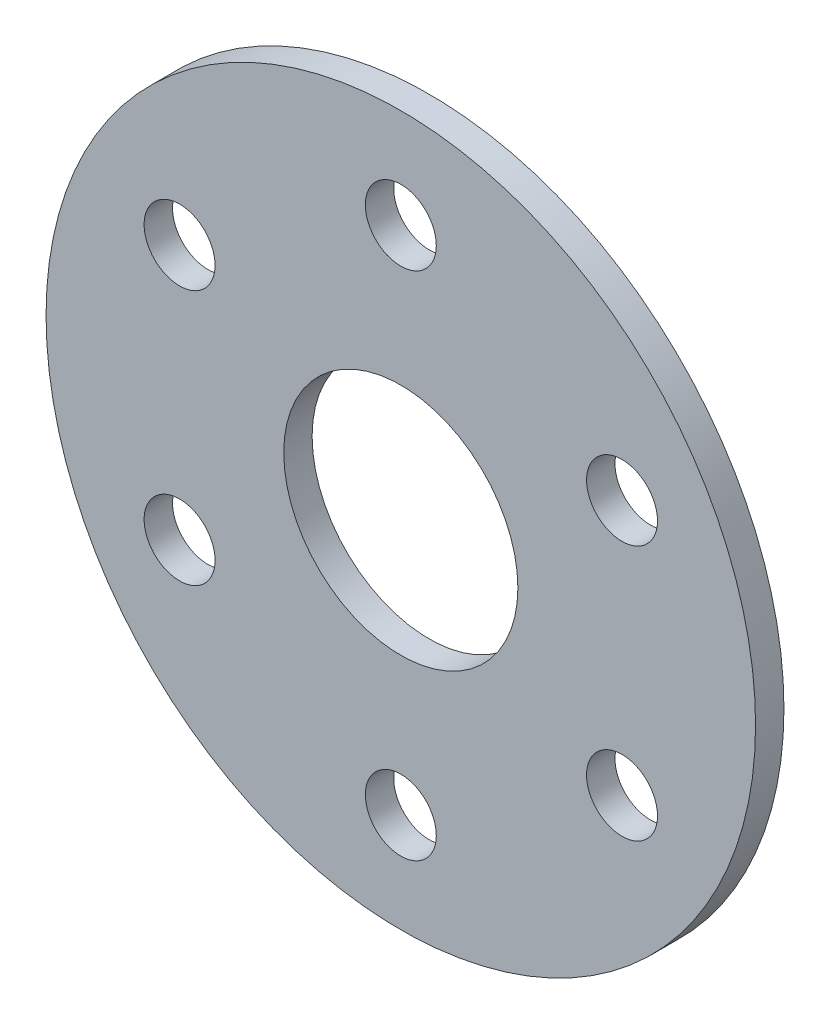
ISO-10303-21;
HEADER;
FILE_DESCRIPTION(('STEP AP214'),'2;1');
FILE_NAME('part.step','',(''),(''),'','','');
FILE_SCHEMA(('AUTOMOTIVE_DESIGN { 1 0 10303 214 1 1 1 1 }'));
ENDSEC;
DATA;
#1=APPLICATION_CONTEXT('core data for automotive mechanical design processes');
#2=APPLICATION_PROTOCOL_DEFINITION('international standard','automotive_design',2000,#1);
#3=PRODUCT_CONTEXT('',#1,'mechanical');
#4=PRODUCT('Part','Part','',(#3));
#5=PRODUCT_RELATED_PRODUCT_CATEGORY('part','',(#4));
#6=PRODUCT_DEFINITION_FORMATION('','',#4);
#7=PRODUCT_DEFINITION_CONTEXT('part definition',#1,'design');
#8=PRODUCT_DEFINITION('design','',#6,#7);
#9=PRODUCT_DEFINITION_SHAPE('','',#8);
#10=(LENGTH_UNIT() NAMED_UNIT(*) SI_UNIT(.MILLI.,.METRE.));
#11=(NAMED_UNIT(*) PLANE_ANGLE_UNIT() SI_UNIT($,.RADIAN.));
#12=(NAMED_UNIT(*) SI_UNIT($,.STERADIAN.) SOLID_ANGLE_UNIT());
#13=UNCERTAINTY_MEASURE_WITH_UNIT(LENGTH_MEASURE(1.E-05),#10,'distance_accuracy_value','');
#14=(GEOMETRIC_REPRESENTATION_CONTEXT(3) GLOBAL_UNCERTAINTY_ASSIGNED_CONTEXT((#13)) GLOBAL_UNIT_ASSIGNED_CONTEXT((#10,
#11,#12)) REPRESENTATION_CONTEXT('',''));
#15=CARTESIAN_POINT('',(0.,0.,0.));
#16=DIRECTION('',(0.,0.,1.));
#17=DIRECTION('',(1.,0.,0.));
#18=AXIS2_PLACEMENT_3D('',#15,#16,#17);
#19=CARTESIAN_POINT('',(0.,0.,1.));
#20=DIRECTION('',(0.,0.,1.));
#21=DIRECTION('',(1.,0.,0.));
#22=AXIS2_PLACEMENT_3D('',#19,#20,#21);
#23=PLANE('',#22);
#24=CARTESIAN_POINT('',(-15.5884572681187,-9.00000000000067,1.));
#25=DIRECTION('',(0.,0.,1.));
#26=DIRECTION('',(1.,0.,0.));
#27=AXIS2_PLACEMENT_3D('',#24,#25,#26);
#28=CIRCLE('',#27,2.50000000000146);
#29=CARTESIAN_POINT('',(-13.0884572681173,-9.00000000000067,1.));
#30=VERTEX_POINT('',#29);
#31=EDGE_CURVE('E92',#30,#30,#28,.T.);
#32=ORIENTED_EDGE('',*,*,#31,.F.);
#33=EDGE_LOOP('',(#32));
#34=FACE_BOUND('',#33,.T.);
#35=CARTESIAN_POINT('',(15.588457268121,-8.99999999999934,1.));
#36=DIRECTION('',(0.,0.,1.));
#37=DIRECTION('',(1.,0.,0.));
#38=AXIS2_PLACEMENT_3D('',#35,#36,#37);
#39=CIRCLE('',#38,2.50000000000099);
#40=CARTESIAN_POINT('',(18.088457268122,-8.99999999999934,1.));
#41=VERTEX_POINT('',#40);
#42=EDGE_CURVE('E76',#41,#41,#39,.T.);
#43=ORIENTED_EDGE('',*,*,#42,.F.);
#44=EDGE_LOOP('',(#43));
#45=FACE_BOUND('',#44,.T.);
#46=CARTESIAN_POINT('',(0.,18.,1.));
#47=DIRECTION('',(0.,0.,1.));
#48=DIRECTION('',(1.,0.,0.));
#49=AXIS2_PLACEMENT_3D('',#46,#47,#48);
#50=CIRCLE('',#49,2.5);
#51=CARTESIAN_POINT('',(2.5,18.,1.));
#52=VERTEX_POINT('',#51);
#53=EDGE_CURVE('E60',#52,#52,#50,.T.);
#54=ORIENTED_EDGE('',*,*,#53,.F.);
#55=EDGE_LOOP('',(#54));
#56=FACE_BOUND('',#55,.T.);
#57=CARTESIAN_POINT('',(0.,0.,1.));
#58=DIRECTION('',(0.,0.,1.));
#59=DIRECTION('',(1.,0.,0.));
#60=AXIS2_PLACEMENT_3D('',#57,#58,#59);
#61=CIRCLE('',#60,25.);
#62=CARTESIAN_POINT('',(25.,0.,1.));
#63=VERTEX_POINT('',#62);
#64=EDGE_CURVE('E10',#63,#63,#61,.T.);
#65=ORIENTED_EDGE('',*,*,#64,.T.);
#66=EDGE_LOOP('',(#65));
#67=FACE_BOUND('',#66,.T.);
#68=CARTESIAN_POINT('',(0.,0.,1.));
#69=DIRECTION('',(0.,0.,1.));
#70=DIRECTION('',(1.,0.,0.));
#71=AXIS2_PLACEMENT_3D('',#68,#69,#70);
#72=CIRCLE('',#71,8.25);
#73=CARTESIAN_POINT('',(8.25,0.,1.));
#74=VERTEX_POINT('',#73);
#75=EDGE_CURVE('E54',#74,#74,#72,.T.);
#76=ORIENTED_EDGE('',*,*,#75,.F.);
#77=EDGE_LOOP('',(#76));
#78=FACE_BOUND('',#77,.T.);
#79=CARTESIAN_POINT('',(15.5884572681203,9.00000000000066,1.));
#80=DIRECTION('',(0.,0.,1.));
#81=DIRECTION('',(1.,0.,0.));
#82=AXIS2_PLACEMENT_3D('',#79,#80,#81);
#83=CIRCLE('',#82,2.50000000000021);
#84=CARTESIAN_POINT('',(18.0884572681205,9.00000000000066,1.));
#85=VERTEX_POINT('',#84);
#86=EDGE_CURVE('E68',#85,#85,#83,.T.);
#87=ORIENTED_EDGE('',*,*,#86,.F.);
#88=EDGE_LOOP('',(#87));
#89=FACE_BOUND('',#88,.T.);
#90=CARTESIAN_POINT('',(1.52815921652642E-12,-18.,1.));
#91=DIRECTION('',(0.,0.,1.));
#92=DIRECTION('',(1.,0.,0.));
#93=AXIS2_PLACEMENT_3D('',#90,#91,#92);
#94=CIRCLE('',#93,2.50000000000158);
#95=CARTESIAN_POINT('',(2.50000000000311,-18.,1.));
#96=VERTEX_POINT('',#95);
#97=EDGE_CURVE('E84',#96,#96,#94,.T.);
#98=ORIENTED_EDGE('',*,*,#97,.F.);
#99=EDGE_LOOP('',(#98));
#100=FACE_BOUND('',#99,.T.);
#101=CARTESIAN_POINT('',(-15.5884572681195,8.99999999999933,1.));
#102=DIRECTION('',(0.,0.,1.));
#103=DIRECTION('',(1.,0.,0.));
#104=AXIS2_PLACEMENT_3D('',#101,#102,#103);
#105=CIRCLE('',#104,2.50000000000077);
#106=CARTESIAN_POINT('',(-13.0884572681187,8.99999999999933,1.));
#107=VERTEX_POINT('',#106);
#108=EDGE_CURVE('E100',#107,#107,#105,.T.);
#109=ORIENTED_EDGE('',*,*,#108,.F.);
#110=EDGE_LOOP('',(#109));
#111=FACE_BOUND('',#110,.T.);
#112=ADVANCED_FACE('F41',(#34,#45,#56,#67,#78,#89,#100,#111),#23,.T.);
#113=CARTESIAN_POINT('',(0.,0.,-1.));
#114=DIRECTION('',(0.,0.,1.));
#115=DIRECTION('',(1.,0.,0.));
#116=AXIS2_PLACEMENT_3D('',#113,#114,#115);
#117=PLANE('',#116);
#118=CARTESIAN_POINT('',(0.,0.,-1.));
#119=DIRECTION('',(0.,0.,1.));
#120=DIRECTION('',(1.,0.,0.));
#121=AXIS2_PLACEMENT_3D('',#118,#119,#120);
#122=CIRCLE('',#121,25.);
#123=CARTESIAN_POINT('',(25.,0.,-1.));
#124=VERTEX_POINT('',#123);
#125=EDGE_CURVE('E45',#124,#124,#122,.T.);
#126=ORIENTED_EDGE('',*,*,#125,.F.);
#127=EDGE_LOOP('',(#126));
#128=FACE_BOUND('',#127,.T.);
#129=CARTESIAN_POINT('',(0.,0.,-1.));
#130=DIRECTION('',(0.,0.,1.));
#131=DIRECTION('',(1.,0.,0.));
#132=AXIS2_PLACEMENT_3D('',#129,#130,#131);
#133=CIRCLE('',#132,8.25);
#134=CARTESIAN_POINT('',(8.25,0.,-1.));
#135=VERTEX_POINT('',#134);
#136=EDGE_CURVE('E56',#135,#135,#133,.T.);
#137=ORIENTED_EDGE('',*,*,#136,.T.);
#138=EDGE_LOOP('',(#137));
#139=FACE_BOUND('',#138,.T.);
#140=CARTESIAN_POINT('',(0.,18.,-1.));
#141=DIRECTION('',(0.,0.,1.));
#142=DIRECTION('',(1.,0.,0.));
#143=AXIS2_PLACEMENT_3D('',#140,#141,#142);
#144=CIRCLE('',#143,2.5);
#145=CARTESIAN_POINT('',(2.5,18.,-1.));
#146=VERTEX_POINT('',#145);
#147=EDGE_CURVE('E64',#146,#146,#144,.T.);
#148=ORIENTED_EDGE('',*,*,#147,.T.);
#149=EDGE_LOOP('',(#148));
#150=FACE_BOUND('',#149,.T.);
#151=CARTESIAN_POINT('',(15.5884572681203,9.00000000000066,-1.));
#152=DIRECTION('',(0.,0.,1.));
#153=DIRECTION('',(1.,0.,0.));
#154=AXIS2_PLACEMENT_3D('',#151,#152,#153);
#155=CIRCLE('',#154,2.50000000000021);
#156=CARTESIAN_POINT('',(18.0884572681205,9.00000000000066,-1.));
#157=VERTEX_POINT('',#156);
#158=EDGE_CURVE('E72',#157,#157,#155,.T.);
#159=ORIENTED_EDGE('',*,*,#158,.T.);
#160=EDGE_LOOP('',(#159));
#161=FACE_BOUND('',#160,.T.);
#162=CARTESIAN_POINT('',(15.588457268121,-8.99999999999934,-1.));
#163=DIRECTION('',(0.,0.,1.));
#164=DIRECTION('',(1.,0.,0.));
#165=AXIS2_PLACEMENT_3D('',#162,#163,#164);
#166=CIRCLE('',#165,2.50000000000099);
#167=CARTESIAN_POINT('',(18.088457268122,-8.99999999999934,-1.));
#168=VERTEX_POINT('',#167);
#169=EDGE_CURVE('E80',#168,#168,#166,.T.);
#170=ORIENTED_EDGE('',*,*,#169,.T.);
#171=EDGE_LOOP('',(#170));
#172=FACE_BOUND('',#171,.T.);
#173=CARTESIAN_POINT('',(1.52815921652642E-12,-18.,-1.));
#174=DIRECTION('',(0.,0.,1.));
#175=DIRECTION('',(1.,0.,0.));
#176=AXIS2_PLACEMENT_3D('',#173,#174,#175);
#177=CIRCLE('',#176,2.50000000000158);
#178=CARTESIAN_POINT('',(2.50000000000311,-18.,-1.));
#179=VERTEX_POINT('',#178);
#180=EDGE_CURVE('E88',#179,#179,#177,.T.);
#181=ORIENTED_EDGE('',*,*,#180,.T.);
#182=EDGE_LOOP('',(#181));
#183=FACE_BOUND('',#182,.T.);
#184=CARTESIAN_POINT('',(-15.5884572681187,-9.00000000000067,-1.));
#185=DIRECTION('',(0.,0.,1.));
#186=DIRECTION('',(1.,0.,0.));
#187=AXIS2_PLACEMENT_3D('',#184,#185,#186);
#188=CIRCLE('',#187,2.50000000000146);
#189=CARTESIAN_POINT('',(-13.0884572681173,-9.00000000000067,-1.));
#190=VERTEX_POINT('',#189);
#191=EDGE_CURVE('E96',#190,#190,#188,.T.);
#192=ORIENTED_EDGE('',*,*,#191,.T.);
#193=EDGE_LOOP('',(#192));
#194=FACE_BOUND('',#193,.T.);
#195=CARTESIAN_POINT('',(-15.5884572681195,8.99999999999933,-1.));
#196=DIRECTION('',(0.,0.,1.));
#197=DIRECTION('',(1.,0.,0.));
#198=AXIS2_PLACEMENT_3D('',#195,#196,#197);
#199=CIRCLE('',#198,2.50000000000077);
#200=CARTESIAN_POINT('',(-13.0884572681187,8.99999999999933,-1.));
#201=VERTEX_POINT('',#200);
#202=EDGE_CURVE('E104',#201,#201,#199,.T.);
#203=ORIENTED_EDGE('',*,*,#202,.T.);
#204=EDGE_LOOP('',(#203));
#205=FACE_BOUND('',#204,.T.);
#206=ADVANCED_FACE('F116',(#128,#139,#150,#161,#172,#183,#194,#205),#117,.F.);
#207=CARTESIAN_POINT('',(0.,0.,1.));
#208=DIRECTION('',(0.,0.,-1.));
#209=DIRECTION('',(-1.,0.,0.));
#210=AXIS2_PLACEMENT_3D('',#207,#208,#209);
#211=CYLINDRICAL_SURFACE('',#210,25.);
#212=ORIENTED_EDGE('',*,*,#64,.F.);
#213=EDGE_LOOP('',(#212));
#214=FACE_BOUND('',#213,.T.);
#215=ORIENTED_EDGE('',*,*,#125,.T.);
#216=EDGE_LOOP('',(#215));
#217=FACE_BOUND('',#216,.T.);
#218=ADVANCED_FACE('F43',(#214,#217),#211,.T.);
#219=CARTESIAN_POINT('',(0.,0.,1.));
#220=DIRECTION('',(0.,0.,-1.));
#221=DIRECTION('',(-1.,0.,0.));
#222=AXIS2_PLACEMENT_3D('',#219,#220,#221);
#223=CYLINDRICAL_SURFACE('',#222,8.25);
#224=ORIENTED_EDGE('',*,*,#75,.T.);
#225=EDGE_LOOP('',(#224));
#226=FACE_BOUND('',#225,.T.);
#227=ORIENTED_EDGE('',*,*,#136,.F.);
#228=EDGE_LOOP('',(#227));
#229=FACE_BOUND('',#228,.T.);
#230=ADVANCED_FACE('F126',(#226,#229),#223,.F.);
#231=CARTESIAN_POINT('',(0.,18.,1.));
#232=DIRECTION('',(0.,0.,-1.));
#233=DIRECTION('',(-1.,0.,0.));
#234=AXIS2_PLACEMENT_3D('',#231,#232,#233);
#235=CYLINDRICAL_SURFACE('',#234,2.5);
#236=ORIENTED_EDGE('',*,*,#53,.T.);
#237=EDGE_LOOP('',(#236));
#238=FACE_BOUND('',#237,.T.);
#239=ORIENTED_EDGE('',*,*,#147,.F.);
#240=EDGE_LOOP('',(#239));
#241=FACE_BOUND('',#240,.T.);
#242=ADVANCED_FACE('F129',(#238,#241),#235,.F.);
#243=CARTESIAN_POINT('',(15.5884572681203,9.00000000000066,1.));
#244=DIRECTION('',(0.,0.,-1.));
#245=DIRECTION('',(-1.,0.,0.));
#246=AXIS2_PLACEMENT_3D('',#243,#244,#245);
#247=CYLINDRICAL_SURFACE('',#246,2.50000000000021);
#248=ORIENTED_EDGE('',*,*,#86,.T.);
#249=EDGE_LOOP('',(#248));
#250=FACE_BOUND('',#249,.T.);
#251=ORIENTED_EDGE('',*,*,#158,.F.);
#252=EDGE_LOOP('',(#251));
#253=FACE_BOUND('',#252,.T.);
#254=ADVANCED_FACE('F133',(#250,#253),#247,.F.);
#255=CARTESIAN_POINT('',(15.588457268121,-8.99999999999934,1.));
#256=DIRECTION('',(0.,0.,-1.));
#257=DIRECTION('',(-1.,0.,0.));
#258=AXIS2_PLACEMENT_3D('',#255,#256,#257);
#259=CYLINDRICAL_SURFACE('',#258,2.50000000000099);
#260=ORIENTED_EDGE('',*,*,#42,.T.);
#261=EDGE_LOOP('',(#260));
#262=FACE_BOUND('',#261,.T.);
#263=ORIENTED_EDGE('',*,*,#169,.F.);
#264=EDGE_LOOP('',(#263));
#265=FACE_BOUND('',#264,.T.);
#266=ADVANCED_FACE('F137',(#262,#265),#259,.F.);
#267=CARTESIAN_POINT('',(1.52815921652642E-12,-18.,1.));
#268=DIRECTION('',(0.,0.,-1.));
#269=DIRECTION('',(-1.,0.,0.));
#270=AXIS2_PLACEMENT_3D('',#267,#268,#269);
#271=CYLINDRICAL_SURFACE('',#270,2.50000000000158);
#272=ORIENTED_EDGE('',*,*,#97,.T.);
#273=EDGE_LOOP('',(#272));
#274=FACE_BOUND('',#273,.T.);
#275=ORIENTED_EDGE('',*,*,#180,.F.);
#276=EDGE_LOOP('',(#275));
#277=FACE_BOUND('',#276,.T.);
#278=ADVANCED_FACE('F141',(#274,#277),#271,.F.);
#279=CARTESIAN_POINT('',(-15.5884572681187,-9.00000000000067,1.));
#280=DIRECTION('',(0.,0.,-1.));
#281=DIRECTION('',(-1.,0.,0.));
#282=AXIS2_PLACEMENT_3D('',#279,#280,#281);
#283=CYLINDRICAL_SURFACE('',#282,2.50000000000146);
#284=ORIENTED_EDGE('',*,*,#31,.T.);
#285=EDGE_LOOP('',(#284));
#286=FACE_BOUND('',#285,.T.);
#287=ORIENTED_EDGE('',*,*,#191,.F.);
#288=EDGE_LOOP('',(#287));
#289=FACE_BOUND('',#288,.T.);
#290=ADVANCED_FACE('F145',(#286,#289),#283,.F.);
#291=CARTESIAN_POINT('',(-15.5884572681195,8.99999999999933,1.));
#292=DIRECTION('',(0.,0.,-1.));
#293=DIRECTION('',(-1.,0.,0.));
#294=AXIS2_PLACEMENT_3D('',#291,#292,#293);
#295=CYLINDRICAL_SURFACE('',#294,2.50000000000077);
#296=ORIENTED_EDGE('',*,*,#108,.T.);
#297=EDGE_LOOP('',(#296));
#298=FACE_BOUND('',#297,.T.);
#299=ORIENTED_EDGE('',*,*,#202,.F.);
#300=EDGE_LOOP('',(#299));
#301=FACE_BOUND('',#300,.T.);
#302=ADVANCED_FACE('F112',(#298,#301),#295,.F.);
#303=CLOSED_SHELL('',(#112,#206,#218,#230,#242,#254,#266,#278,#290,#302));
#304=MANIFOLD_SOLID_BREP('B2',#303);
#305=ADVANCED_BREP_SHAPE_REPRESENTATION('',(#18,#304),#14);
#306=SHAPE_DEFINITION_REPRESENTATION(#9,#305);
ENDSEC;
END-ISO-10303-21;
